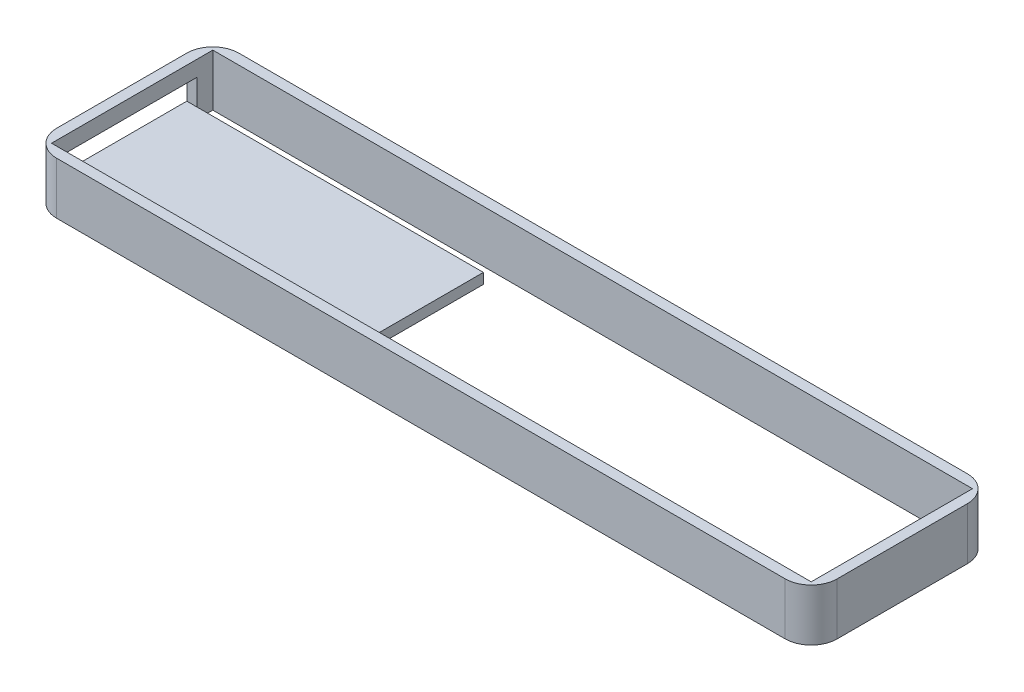
ISO-10303-21;
HEADER;
FILE_DESCRIPTION(('STEP AP214'),'2;1');
FILE_NAME('part.step','',(''),(''),'','','');
FILE_SCHEMA(('AUTOMOTIVE_DESIGN { 1 0 10303 214 1 1 1 1 }'));
ENDSEC;
DATA;
#1=APPLICATION_CONTEXT('core data for automotive mechanical design processes');
#2=APPLICATION_PROTOCOL_DEFINITION('international standard','automotive_design',2000,#1);
#3=PRODUCT_CONTEXT('',#1,'mechanical');
#4=PRODUCT('Part','Part','',(#3));
#5=PRODUCT_RELATED_PRODUCT_CATEGORY('part','',(#4));
#6=PRODUCT_DEFINITION_FORMATION('','',#4);
#7=PRODUCT_DEFINITION_CONTEXT('part definition',#1,'design');
#8=PRODUCT_DEFINITION('design','',#6,#7);
#9=PRODUCT_DEFINITION_SHAPE('','',#8);
#10=(LENGTH_UNIT() NAMED_UNIT(*) SI_UNIT(.MILLI.,.METRE.));
#11=(NAMED_UNIT(*) PLANE_ANGLE_UNIT() SI_UNIT($,.RADIAN.));
#12=(NAMED_UNIT(*) SI_UNIT($,.STERADIAN.) SOLID_ANGLE_UNIT());
#13=UNCERTAINTY_MEASURE_WITH_UNIT(LENGTH_MEASURE(1.E-05),#10,'distance_accuracy_value','');
#14=(GEOMETRIC_REPRESENTATION_CONTEXT(3) GLOBAL_UNCERTAINTY_ASSIGNED_CONTEXT((#13)) GLOBAL_UNIT_ASSIGNED_CONTEXT((#10,
#11,#12)) REPRESENTATION_CONTEXT('',''));
#15=CARTESIAN_POINT('',(0.,0.,0.));
#16=DIRECTION('',(0.,0.,1.));
#17=DIRECTION('',(1.,0.,0.));
#18=AXIS2_PLACEMENT_3D('',#15,#16,#17);
#19=CARTESIAN_POINT('',(-75.,10.,0.));
#20=DIRECTION('',(-1.,0.,0.));
#21=DIRECTION('',(0.,0.,1.));
#22=AXIS2_PLACEMENT_3D('',#19,#20,#21);
#23=PLANE('',#22);
#24=DIRECTION('',(0.,0.,-1.));
#25=VECTOR('',#24,1.);
#26=CARTESIAN_POINT('',(-75.,10.,0.));
#27=LINE('',#26,#25);
#28=CARTESIAN_POINT('',(-75.,10.,12.5));
#29=VERTEX_POINT('',#28);
#30=CARTESIAN_POINT('',(-75.,10.,-12.5));
#31=VERTEX_POINT('',#30);
#32=EDGE_CURVE('E248',#29,#31,#27,.T.);
#33=ORIENTED_EDGE('',*,*,#32,.T.);
#34=DIRECTION('',(0.,-1.,0.));
#35=VECTOR('',#34,1.);
#36=CARTESIAN_POINT('',(-75.,10.,-12.5));
#37=LINE('',#36,#35);
#38=CARTESIAN_POINT('',(-75.,7.,-12.5));
#39=VERTEX_POINT('',#38);
#40=EDGE_CURVE('E11',#31,#39,#37,.T.);
#41=ORIENTED_EDGE('',*,*,#40,.T.);
#42=DIRECTION('',(0.,0.,-1.));
#43=VECTOR('',#42,1.);
#44=CARTESIAN_POINT('',(-75.,7.,-12.5));
#45=LINE('',#44,#43);
#46=CARTESIAN_POINT('',(-75.,7.,12.5));
#47=VERTEX_POINT('',#46);
#48=EDGE_CURVE('E204',#47,#39,#45,.T.);
#49=ORIENTED_EDGE('',*,*,#48,.F.);
#50=DIRECTION('',(0.,-1.,0.));
#51=VECTOR('',#50,1.);
#52=CARTESIAN_POINT('',(-75.,10.,12.5));
#53=LINE('',#52,#51);
#54=EDGE_CURVE('E61',#47,#29,#53,.F.);
#55=ORIENTED_EDGE('',*,*,#54,.T.);
#56=EDGE_LOOP('',(#33,#41,#49,#55));
#57=FACE_BOUND('',#56,.T.);
#58=ADVANCED_FACE('F39',(#57),#23,.T.);
#59=CARTESIAN_POINT('',(0.,10.,12.5));
#60=DIRECTION('',(0.,0.,-1.));
#61=DIRECTION('',(-1.,0.,0.));
#62=AXIS2_PLACEMENT_3D('',#59,#60,#61);
#63=PLANE('',#62);
#64=DIRECTION('',(1.,0.,0.));
#65=VECTOR('',#64,1.);
#66=CARTESIAN_POINT('',(-73.,2.,12.5));
#67=LINE('',#66,#65);
#68=CARTESIAN_POINT('',(-73.,2.,12.5));
#69=VERTEX_POINT('',#68);
#70=CARTESIAN_POINT('',(-18.,2.,12.5));
#71=VERTEX_POINT('',#70);
#72=EDGE_CURVE('E222',#69,#71,#67,.T.);
#73=ORIENTED_EDGE('',*,*,#72,.F.);
#74=DIRECTION('',(0.,-1.,0.));
#75=VECTOR('',#74,1.);
#76=CARTESIAN_POINT('',(-73.,10.,12.5));
#77=LINE('',#76,#75);
#78=CARTESIAN_POINT('',(-73.,0.,12.5));
#79=VERTEX_POINT('',#78);
#80=EDGE_CURVE('E292',#69,#79,#77,.T.);
#81=ORIENTED_EDGE('',*,*,#80,.T.);
#82=DIRECTION('',(1.,0.,0.));
#83=VECTOR('',#82,1.);
#84=CARTESIAN_POINT('',(0.,0.,12.5));
#85=LINE('',#84,#83);
#86=CARTESIAN_POINT('',(-18.,0.,12.5));
#87=VERTEX_POINT('',#86);
#88=EDGE_CURVE('E259',#79,#87,#85,.T.);
#89=ORIENTED_EDGE('',*,*,#88,.T.);
#90=DIRECTION('',(0.,-1.,0.));
#91=VECTOR('',#90,1.);
#92=CARTESIAN_POINT('',(-18.,10.,12.5));
#93=LINE('',#92,#91);
#94=EDGE_CURVE('E290',#71,#87,#93,.T.);
#95=ORIENTED_EDGE('',*,*,#94,.F.);
#96=EDGE_LOOP('',(#73,#81,#89,#95));
#97=FACE_BOUND('',#96,.T.);
#98=ADVANCED_FACE('F369',(#97),#63,.F.);
#99=CARTESIAN_POINT('',(-18.,10.,0.));
#100=DIRECTION('',(1.,0.,0.));
#101=DIRECTION('',(0.,0.,-1.));
#102=AXIS2_PLACEMENT_3D('',#99,#100,#101);
#103=PLANE('',#102);
#104=DIRECTION('',(0.,-1.,0.));
#105=VECTOR('',#104,1.);
#106=CARTESIAN_POINT('',(-18.,10.,-12.5));
#107=LINE('',#106,#105);
#108=CARTESIAN_POINT('',(-18.,2.,-12.5));
#109=VERTEX_POINT('',#108);
#110=CARTESIAN_POINT('',(-18.,0.,-12.5));
#111=VERTEX_POINT('',#110);
#112=EDGE_CURVE('E288',#109,#111,#107,.T.);
#113=ORIENTED_EDGE('',*,*,#112,.F.);
#114=DIRECTION('',(0.,0.,-1.));
#115=VECTOR('',#114,1.);
#116=CARTESIAN_POINT('',(-18.,2.,-12.5));
#117=LINE('',#116,#115);
#118=EDGE_CURVE('E224',#71,#109,#117,.T.);
#119=ORIENTED_EDGE('',*,*,#118,.F.);
#120=ORIENTED_EDGE('',*,*,#94,.T.);
#121=DIRECTION('',(0.,0.,1.));
#122=VECTOR('',#121,1.);
#123=CARTESIAN_POINT('',(-18.,0.,0.));
#124=LINE('',#123,#122);
#125=EDGE_CURVE('E263',#111,#87,#124,.T.);
#126=ORIENTED_EDGE('',*,*,#125,.F.);
#127=EDGE_LOOP('',(#113,#119,#120,#126));
#128=FACE_BOUND('',#127,.T.);
#129=ADVANCED_FACE('F375',(#128),#103,.T.);
#130=CARTESIAN_POINT('',(0.,10.,-12.5));
#131=DIRECTION('',(0.,0.,-1.));
#132=DIRECTION('',(-1.,0.,0.));
#133=AXIS2_PLACEMENT_3D('',#130,#131,#132);
#134=PLANE('',#133);
#135=DIRECTION('',(0.,-1.,0.));
#136=VECTOR('',#135,1.);
#137=CARTESIAN_POINT('',(-73.,10.,-12.5));
#138=LINE('',#137,#136);
#139=CARTESIAN_POINT('',(-73.,2.,-12.5));
#140=VERTEX_POINT('',#139);
#141=CARTESIAN_POINT('',(-73.,0.,-12.5));
#142=VERTEX_POINT('',#141);
#143=EDGE_CURVE('E286',#140,#142,#138,.T.);
#144=ORIENTED_EDGE('',*,*,#143,.F.);
#145=DIRECTION('',(-1.,0.,0.));
#146=VECTOR('',#145,1.);
#147=CARTESIAN_POINT('',(-73.,2.,-12.5));
#148=LINE('',#147,#146);
#149=EDGE_CURVE('E226',#109,#140,#148,.T.);
#150=ORIENTED_EDGE('',*,*,#149,.F.);
#151=ORIENTED_EDGE('',*,*,#112,.T.);
#152=DIRECTION('',(1.,0.,0.));
#153=VECTOR('',#152,1.);
#154=CARTESIAN_POINT('',(0.,0.,-12.5));
#155=LINE('',#154,#153);
#156=EDGE_CURVE('E266',#142,#111,#155,.T.);
#157=ORIENTED_EDGE('',*,*,#156,.F.);
#158=EDGE_LOOP('',(#144,#150,#151,#157));
#159=FACE_BOUND('',#158,.T.);
#160=ADVANCED_FACE('F380',(#159),#134,.T.);
#161=CARTESIAN_POINT('',(0.,10.,17.5));
#162=DIRECTION('',(0.,0.,-1.));
#163=DIRECTION('',(-1.,0.,0.));
#164=AXIS2_PLACEMENT_3D('',#161,#162,#163);
#165=PLANE('',#164);
#166=DIRECTION('',(1.,0.,0.));
#167=VECTOR('',#166,1.);
#168=CARTESIAN_POINT('',(0.,0.,17.5));
#169=LINE('',#168,#167);
#170=CARTESIAN_POINT('',(-70.,0.,17.5));
#171=VERTEX_POINT('',#170);
#172=CARTESIAN_POINT('',(70.,0.,17.5));
#173=VERTEX_POINT('',#172);
#174=EDGE_CURVE('E272',#171,#173,#169,.T.);
#175=ORIENTED_EDGE('',*,*,#174,.T.);
#176=DIRECTION('',(0.,-1.,0.));
#177=VECTOR('',#176,1.);
#178=CARTESIAN_POINT('',(70.,10.,17.5));
#179=LINE('',#178,#177);
#180=CARTESIAN_POINT('',(70.,10.,17.5));
#181=VERTEX_POINT('',#180);
#182=EDGE_CURVE('E326',#173,#181,#179,.F.);
#183=ORIENTED_EDGE('',*,*,#182,.T.);
#184=DIRECTION('',(1.,0.,0.));
#185=VECTOR('',#184,1.);
#186=CARTESIAN_POINT('',(0.,10.,17.5));
#187=LINE('',#186,#185);
#188=CARTESIAN_POINT('',(-70.,10.,17.5));
#189=VERTEX_POINT('',#188);
#190=EDGE_CURVE('E239',#189,#181,#187,.T.);
#191=ORIENTED_EDGE('',*,*,#190,.F.);
#192=DIRECTION('',(0.,-1.,0.));
#193=VECTOR('',#192,1.);
#194=CARTESIAN_POINT('',(-70.,0.,17.5));
#195=LINE('',#194,#193);
#196=EDGE_CURVE('E323',#189,#171,#195,.T.);
#197=ORIENTED_EDGE('',*,*,#196,.T.);
#198=EDGE_LOOP('',(#175,#183,#191,#197));
#199=FACE_BOUND('',#198,.T.);
#200=ADVANCED_FACE('F355',(#199),#165,.F.);
#201=CARTESIAN_POINT('',(75.,10.,0.));
#202=DIRECTION('',(-1.,0.,0.));
#203=DIRECTION('',(0.,0.,1.));
#204=AXIS2_PLACEMENT_3D('',#201,#202,#203);
#205=PLANE('',#204);
#206=DIRECTION('',(0.,0.,-1.));
#207=VECTOR('',#206,1.);
#208=CARTESIAN_POINT('',(75.,0.,0.));
#209=LINE('',#208,#207);
#210=CARTESIAN_POINT('',(75.,0.,12.5));
#211=VERTEX_POINT('',#210);
#212=CARTESIAN_POINT('',(75.,0.,-12.5));
#213=VERTEX_POINT('',#212);
#214=EDGE_CURVE('E275',#211,#213,#209,.T.);
#215=ORIENTED_EDGE('',*,*,#214,.T.);
#216=DIRECTION('',(0.,-1.,0.));
#217=VECTOR('',#216,1.);
#218=CARTESIAN_POINT('',(75.,10.,-12.5));
#219=LINE('',#218,#217);
#220=CARTESIAN_POINT('',(75.,10.,-12.5));
#221=VERTEX_POINT('',#220);
#222=EDGE_CURVE('E314',#213,#221,#219,.F.);
#223=ORIENTED_EDGE('',*,*,#222,.T.);
#224=DIRECTION('',(0.,0.,-1.));
#225=VECTOR('',#224,1.);
#226=CARTESIAN_POINT('',(75.,10.,0.));
#227=LINE('',#226,#225);
#228=CARTESIAN_POINT('',(75.,10.,12.5));
#229=VERTEX_POINT('',#228);
#230=EDGE_CURVE('E242',#229,#221,#227,.T.);
#231=ORIENTED_EDGE('',*,*,#230,.F.);
#232=DIRECTION('',(0.,-1.,0.));
#233=VECTOR('',#232,1.);
#234=CARTESIAN_POINT('',(75.,10.,12.5));
#235=LINE('',#234,#233);
#236=EDGE_CURVE('E311',#229,#211,#235,.T.);
#237=ORIENTED_EDGE('',*,*,#236,.T.);
#238=EDGE_LOOP('',(#215,#223,#231,#237));
#239=FACE_BOUND('',#238,.T.);
#240=ADVANCED_FACE('F348',(#239),#205,.F.);
#241=CARTESIAN_POINT('',(0.,10.,-17.5));
#242=DIRECTION('',(0.,0.,-1.));
#243=DIRECTION('',(-1.,0.,0.));
#244=AXIS2_PLACEMENT_3D('',#241,#242,#243);
#245=PLANE('',#244);
#246=DIRECTION('',(1.,0.,0.));
#247=VECTOR('',#246,1.);
#248=CARTESIAN_POINT('',(0.,10.,-17.5));
#249=LINE('',#248,#247);
#250=CARTESIAN_POINT('',(-70.,10.,-17.5));
#251=VERTEX_POINT('',#250);
#252=CARTESIAN_POINT('',(70.,10.,-17.5));
#253=VERTEX_POINT('',#252);
#254=EDGE_CURVE('E245',#251,#253,#249,.T.);
#255=ORIENTED_EDGE('',*,*,#254,.T.);
#256=DIRECTION('',(0.,-1.,0.));
#257=VECTOR('',#256,1.);
#258=CARTESIAN_POINT('',(70.,0.,-17.5));
#259=LINE('',#258,#257);
#260=CARTESIAN_POINT('',(70.,0.,-17.5));
#261=VERTEX_POINT('',#260);
#262=EDGE_CURVE('E300',#253,#261,#259,.T.);
#263=ORIENTED_EDGE('',*,*,#262,.T.);
#264=DIRECTION('',(1.,0.,0.));
#265=VECTOR('',#264,1.);
#266=CARTESIAN_POINT('',(0.,0.,-17.5));
#267=LINE('',#266,#265);
#268=CARTESIAN_POINT('',(-70.,0.,-17.5));
#269=VERTEX_POINT('',#268);
#270=EDGE_CURVE('E278',#269,#261,#267,.T.);
#271=ORIENTED_EDGE('',*,*,#270,.F.);
#272=DIRECTION('',(0.,-1.,0.));
#273=VECTOR('',#272,1.);
#274=CARTESIAN_POINT('',(-70.,10.,-17.5));
#275=LINE('',#274,#273);
#276=EDGE_CURVE('E298',#269,#251,#275,.F.);
#277=ORIENTED_EDGE('',*,*,#276,.T.);
#278=EDGE_LOOP('',(#255,#263,#271,#277));
#279=FACE_BOUND('',#278,.T.);
#280=ADVANCED_FACE('F338',(#279),#245,.T.);
#281=CARTESIAN_POINT('',(73.,10.,0.));
#282=DIRECTION('',(-1.,0.,0.));
#283=DIRECTION('',(0.,0.,1.));
#284=AXIS2_PLACEMENT_3D('',#281,#282,#283);
#285=PLANE('',#284);
#286=DIRECTION('',(0.,0.,-1.));
#287=VECTOR('',#286,1.);
#288=CARTESIAN_POINT('',(73.,0.,0.));
#289=LINE('',#288,#287);
#290=CARTESIAN_POINT('',(73.,0.,15.5));
#291=VERTEX_POINT('',#290);
#292=CARTESIAN_POINT('',(73.,0.,-15.5));
#293=VERTEX_POINT('',#292);
#294=EDGE_CURVE('E228',#291,#293,#289,.T.);
#295=ORIENTED_EDGE('',*,*,#294,.F.);
#296=DIRECTION('',(0.,-1.,0.));
#297=VECTOR('',#296,1.);
#298=CARTESIAN_POINT('',(73.,10.,15.5));
#299=LINE('',#298,#297);
#300=CARTESIAN_POINT('',(73.,10.,15.5));
#301=VERTEX_POINT('',#300);
#302=EDGE_CURVE('E296',#301,#291,#299,.T.);
#303=ORIENTED_EDGE('',*,*,#302,.F.);
#304=DIRECTION('',(0.,0.,-1.));
#305=VECTOR('',#304,1.);
#306=CARTESIAN_POINT('',(73.,10.,0.));
#307=LINE('',#306,#305);
#308=CARTESIAN_POINT('',(73.,10.,-15.5));
#309=VERTEX_POINT('',#308);
#310=EDGE_CURVE('E229',#301,#309,#307,.T.);
#311=ORIENTED_EDGE('',*,*,#310,.T.);
#312=DIRECTION('',(0.,-1.,0.));
#313=VECTOR('',#312,1.);
#314=CARTESIAN_POINT('',(73.,10.,-15.5));
#315=LINE('',#314,#313);
#316=EDGE_CURVE('E250',#309,#293,#315,.T.);
#317=ORIENTED_EDGE('',*,*,#316,.T.);
#318=EDGE_LOOP('',(#295,#303,#311,#317));
#319=FACE_BOUND('',#318,.T.);
#320=ADVANCED_FACE('F398',(#319),#285,.T.);
#321=CARTESIAN_POINT('',(0.,10.,15.5));
#322=DIRECTION('',(0.,0.,-1.));
#323=DIRECTION('',(-1.,0.,0.));
#324=AXIS2_PLACEMENT_3D('',#321,#322,#323);
#325=PLANE('',#324);
#326=DIRECTION('',(1.,0.,0.));
#327=VECTOR('',#326,1.);
#328=CARTESIAN_POINT('',(0.,0.,15.5));
#329=LINE('',#328,#327);
#330=CARTESIAN_POINT('',(-73.,0.,15.5));
#331=VERTEX_POINT('',#330);
#332=EDGE_CURVE('E253',#331,#291,#329,.T.);
#333=ORIENTED_EDGE('',*,*,#332,.F.);
#334=DIRECTION('',(0.,-1.,0.));
#335=VECTOR('',#334,1.);
#336=CARTESIAN_POINT('',(-73.,10.,15.5));
#337=LINE('',#336,#335);
#338=CARTESIAN_POINT('',(-73.,10.,15.5));
#339=VERTEX_POINT('',#338);
#340=EDGE_CURVE('E294',#339,#331,#337,.T.);
#341=ORIENTED_EDGE('',*,*,#340,.F.);
#342=DIRECTION('',(1.,0.,0.));
#343=VECTOR('',#342,1.);
#344=CARTESIAN_POINT('',(0.,10.,15.5));
#345=LINE('',#344,#343);
#346=EDGE_CURVE('E232',#339,#301,#345,.T.);
#347=ORIENTED_EDGE('',*,*,#346,.T.);
#348=ORIENTED_EDGE('',*,*,#302,.T.);
#349=EDGE_LOOP('',(#333,#341,#347,#348));
#350=FACE_BOUND('',#349,.T.);
#351=ADVANCED_FACE('F396',(#350),#325,.T.);
#352=CARTESIAN_POINT('',(-73.,10.,0.));
#353=DIRECTION('',(-1.,0.,0.));
#354=DIRECTION('',(0.,0.,1.));
#355=AXIS2_PLACEMENT_3D('',#352,#353,#354);
#356=PLANE('',#355);
#357=DIRECTION('',(0.,0.,-1.));
#358=VECTOR('',#357,1.);
#359=CARTESIAN_POINT('',(-73.,7.,0.));
#360=LINE('',#359,#358);
#361=CARTESIAN_POINT('',(-73.,7.,12.5));
#362=VERTEX_POINT('',#361);
#363=CARTESIAN_POINT('',(-73.,7.,-12.5));
#364=VERTEX_POINT('',#363);
#365=EDGE_CURVE('E219',#362,#364,#360,.T.);
#366=ORIENTED_EDGE('',*,*,#365,.T.);
#367=DIRECTION('',(0.,-1.,0.));
#368=VECTOR('',#367,1.);
#369=CARTESIAN_POINT('',(-73.,10.,-12.5));
#370=LINE('',#369,#368);
#371=EDGE_CURVE('E216',#364,#140,#370,.T.);
#372=ORIENTED_EDGE('',*,*,#371,.T.);
#373=ORIENTED_EDGE('',*,*,#143,.T.);
#374=DIRECTION('',(0.,0.,-1.));
#375=VECTOR('',#374,1.);
#376=CARTESIAN_POINT('',(-73.,0.,0.));
#377=LINE('',#376,#375);
#378=CARTESIAN_POINT('',(-73.,0.,-15.5));
#379=VERTEX_POINT('',#378);
#380=EDGE_CURVE('E260',#142,#379,#377,.T.);
#381=ORIENTED_EDGE('',*,*,#380,.T.);
#382=DIRECTION('',(0.,-1.,0.));
#383=VECTOR('',#382,1.);
#384=CARTESIAN_POINT('',(-73.,10.,-15.5));
#385=LINE('',#384,#383);
#386=CARTESIAN_POINT('',(-73.,10.,-15.5));
#387=VERTEX_POINT('',#386);
#388=EDGE_CURVE('E283',#387,#379,#385,.T.);
#389=ORIENTED_EDGE('',*,*,#388,.F.);
#390=DIRECTION('',(0.,0.,-1.));
#391=VECTOR('',#390,1.);
#392=CARTESIAN_POINT('',(-73.,10.,0.));
#393=LINE('',#392,#391);
#394=EDGE_CURVE('E235',#339,#387,#393,.T.);
#395=ORIENTED_EDGE('',*,*,#394,.F.);
#396=ORIENTED_EDGE('',*,*,#340,.T.);
#397=EDGE_CURVE('E256',#331,#79,#377,.T.);
#398=ORIENTED_EDGE('',*,*,#397,.T.);
#399=ORIENTED_EDGE('',*,*,#80,.F.);
#400=DIRECTION('',(0.,1.,0.));
#401=VECTOR('',#400,1.);
#402=CARTESIAN_POINT('',(-73.,10.,12.5));
#403=LINE('',#402,#401);
#404=EDGE_CURVE('E192',#69,#362,#403,.T.);
#405=ORIENTED_EDGE('',*,*,#404,.T.);
#406=EDGE_LOOP('',(#366,#372,#373,#381,#389,#395,#396,#398,#399,#405));
#407=FACE_BOUND('',#406,.T.);
#408=ADVANCED_FACE('F365',(#407),#356,.F.);
#409=CARTESIAN_POINT('',(0.,10.,-15.5));
#410=DIRECTION('',(0.,0.,-1.));
#411=DIRECTION('',(-1.,0.,0.));
#412=AXIS2_PLACEMENT_3D('',#409,#410,#411);
#413=PLANE('',#412);
#414=DIRECTION('',(1.,0.,0.));
#415=VECTOR('',#414,1.);
#416=CARTESIAN_POINT('',(0.,0.,-15.5));
#417=LINE('',#416,#415);
#418=EDGE_CURVE('E269',#379,#293,#417,.T.);
#419=ORIENTED_EDGE('',*,*,#418,.T.);
#420=ORIENTED_EDGE('',*,*,#316,.F.);
#421=DIRECTION('',(1.,0.,0.));
#422=VECTOR('',#421,1.);
#423=CARTESIAN_POINT('',(0.,10.,-15.5));
#424=LINE('',#423,#422);
#425=EDGE_CURVE('E237',#387,#309,#424,.T.);
#426=ORIENTED_EDGE('',*,*,#425,.F.);
#427=ORIENTED_EDGE('',*,*,#388,.T.);
#428=EDGE_LOOP('',(#419,#420,#426,#427));
#429=FACE_BOUND('',#428,.T.);
#430=ADVANCED_FACE('F388',(#429),#413,.F.);
#431=DIRECTION('',(0.,0.,1.));
#432=VECTOR('',#431,1.);
#433=CARTESIAN_POINT('',(-75.,2.,-12.5));
#434=LINE('',#433,#432);
#435=CARTESIAN_POINT('',(-75.,2.,-12.5));
#436=VERTEX_POINT('',#435);
#437=CARTESIAN_POINT('',(-75.,2.,12.5));
#438=VERTEX_POINT('',#437);
#439=EDGE_CURVE('E177',#436,#438,#434,.T.);
#440=ORIENTED_EDGE('',*,*,#439,.F.);
#441=DIRECTION('',(0.,-1.,0.));
#442=VECTOR('',#441,1.);
#443=CARTESIAN_POINT('',(-75.,10.,-12.5));
#444=LINE('',#443,#442);
#445=CARTESIAN_POINT('',(-75.,0.,-12.5));
#446=VERTEX_POINT('',#445);
#447=EDGE_CURVE('E47',#436,#446,#444,.T.);
#448=ORIENTED_EDGE('',*,*,#447,.T.);
#449=DIRECTION('',(0.,0.,-1.));
#450=VECTOR('',#449,1.);
#451=CARTESIAN_POINT('',(-75.,0.,0.));
#452=LINE('',#451,#450);
#453=CARTESIAN_POINT('',(-75.,0.,12.5));
#454=VERTEX_POINT('',#453);
#455=EDGE_CURVE('E180',#454,#446,#452,.T.);
#456=ORIENTED_EDGE('',*,*,#455,.F.);
#457=DIRECTION('',(0.,-1.,0.));
#458=VECTOR('',#457,1.);
#459=CARTESIAN_POINT('',(-75.,10.,12.5));
#460=LINE('',#459,#458);
#461=EDGE_CURVE('E173',#454,#438,#460,.F.);
#462=ORIENTED_EDGE('',*,*,#461,.T.);
#463=EDGE_LOOP('',(#440,#448,#456,#462));
#464=FACE_BOUND('',#463,.T.);
#465=ADVANCED_FACE('F175',(#464),#23,.T.);
#466=CARTESIAN_POINT('',(0.,10.,0.));
#467=DIRECTION('',(0.,1.,0.));
#468=DIRECTION('',(0.,0.,1.));
#469=AXIS2_PLACEMENT_3D('',#466,#467,#468);
#470=PLANE('',#469);
#471=ORIENTED_EDGE('',*,*,#394,.T.);
#472=ORIENTED_EDGE('',*,*,#425,.T.);
#473=ORIENTED_EDGE('',*,*,#310,.F.);
#474=ORIENTED_EDGE('',*,*,#346,.F.);
#475=EDGE_LOOP('',(#471,#472,#473,#474));
#476=FACE_BOUND('',#475,.T.);
#477=ORIENTED_EDGE('',*,*,#230,.T.);
#478=CARTESIAN_POINT('',(70.,10.,-12.5));
#479=DIRECTION('',(0.,1.,0.));
#480=DIRECTION('',(0.,0.,1.));
#481=AXIS2_PLACEMENT_3D('',#478,#479,#480);
#482=CIRCLE('',#481,5.);
#483=EDGE_CURVE('E321',#221,#253,#482,.T.);
#484=ORIENTED_EDGE('',*,*,#483,.T.);
#485=ORIENTED_EDGE('',*,*,#254,.F.);
#486=CARTESIAN_POINT('',(-70.,10.,-12.5));
#487=DIRECTION('',(0.,1.,0.));
#488=DIRECTION('',(0.,0.,1.));
#489=AXIS2_PLACEMENT_3D('',#486,#487,#488);
#490=CIRCLE('',#489,5.);
#491=EDGE_CURVE('E54',#251,#31,#490,.T.);
#492=ORIENTED_EDGE('',*,*,#491,.T.);
#493=ORIENTED_EDGE('',*,*,#32,.F.);
#494=CARTESIAN_POINT('',(-70.,10.,12.5));
#495=DIRECTION('',(0.,1.,0.));
#496=DIRECTION('',(0.,0.,1.));
#497=AXIS2_PLACEMENT_3D('',#494,#495,#496);
#498=CIRCLE('',#497,5.);
#499=EDGE_CURVE('E316',#29,#189,#498,.T.);
#500=ORIENTED_EDGE('',*,*,#499,.T.);
#501=ORIENTED_EDGE('',*,*,#190,.T.);
#502=CARTESIAN_POINT('',(70.,10.,12.5));
#503=DIRECTION('',(0.,1.,0.));
#504=DIRECTION('',(0.,0.,1.));
#505=AXIS2_PLACEMENT_3D('',#502,#503,#504);
#506=CIRCLE('',#505,5.);
#507=EDGE_CURVE('E319',#181,#229,#506,.T.);
#508=ORIENTED_EDGE('',*,*,#507,.T.);
#509=EDGE_LOOP('',(#477,#484,#485,#492,#493,#500,#501,#508));
#510=FACE_BOUND('',#509,.T.);
#511=ADVANCED_FACE('F340',(#476,#510),#470,.T.);
#512=CARTESIAN_POINT('',(0.,0.,0.));
#513=DIRECTION('',(0.,1.,0.));
#514=DIRECTION('',(0.,0.,1.));
#515=AXIS2_PLACEMENT_3D('',#512,#513,#514);
#516=PLANE('',#515);
#517=ORIENTED_EDGE('',*,*,#294,.T.);
#518=ORIENTED_EDGE('',*,*,#418,.F.);
#519=ORIENTED_EDGE('',*,*,#380,.F.);
#520=ORIENTED_EDGE('',*,*,#156,.T.);
#521=ORIENTED_EDGE('',*,*,#125,.T.);
#522=ORIENTED_EDGE('',*,*,#88,.F.);
#523=ORIENTED_EDGE('',*,*,#397,.F.);
#524=ORIENTED_EDGE('',*,*,#332,.T.);
#525=EDGE_LOOP('',(#517,#518,#519,#520,#521,#522,#523,#524));
#526=FACE_BOUND('',#525,.T.);
#527=ORIENTED_EDGE('',*,*,#270,.T.);
#528=CARTESIAN_POINT('',(70.,0.,-12.5));
#529=DIRECTION('',(0.,1.,0.));
#530=DIRECTION('',(0.,0.,1.));
#531=AXIS2_PLACEMENT_3D('',#528,#529,#530);
#532=CIRCLE('',#531,5.);
#533=EDGE_CURVE('E309',#261,#213,#532,.F.);
#534=ORIENTED_EDGE('',*,*,#533,.T.);
#535=ORIENTED_EDGE('',*,*,#214,.F.);
#536=CARTESIAN_POINT('',(70.,0.,12.5));
#537=DIRECTION('',(0.,1.,0.));
#538=DIRECTION('',(0.,0.,1.));
#539=AXIS2_PLACEMENT_3D('',#536,#537,#538);
#540=CIRCLE('',#539,5.);
#541=EDGE_CURVE('E307',#211,#173,#540,.F.);
#542=ORIENTED_EDGE('',*,*,#541,.T.);
#543=ORIENTED_EDGE('',*,*,#174,.F.);
#544=CARTESIAN_POINT('',(-70.,0.,12.5));
#545=DIRECTION('',(0.,1.,0.));
#546=DIRECTION('',(0.,0.,1.));
#547=AXIS2_PLACEMENT_3D('',#544,#545,#546);
#548=CIRCLE('',#547,5.);
#549=EDGE_CURVE('E303',#171,#454,#548,.F.);
#550=ORIENTED_EDGE('',*,*,#549,.T.);
#551=ORIENTED_EDGE('',*,*,#455,.T.);
#552=CARTESIAN_POINT('',(-70.,0.,-12.5));
#553=DIRECTION('',(0.,1.,0.));
#554=DIRECTION('',(0.,0.,1.));
#555=AXIS2_PLACEMENT_3D('',#552,#553,#554);
#556=CIRCLE('',#555,5.);
#557=EDGE_CURVE('E305',#446,#269,#556,.F.);
#558=ORIENTED_EDGE('',*,*,#557,.T.);
#559=EDGE_LOOP('',(#527,#534,#535,#542,#543,#550,#551,#558));
#560=FACE_BOUND('',#559,.T.);
#561=ADVANCED_FACE('F331',(#526,#560),#516,.F.);
#562=CARTESIAN_POINT('',(0.,2.,0.));
#563=DIRECTION('',(0.,1.,0.));
#564=DIRECTION('',(0.,0.,1.));
#565=AXIS2_PLACEMENT_3D('',#562,#563,#564);
#566=PLANE('',#565);
#567=ORIENTED_EDGE('',*,*,#72,.T.);
#568=ORIENTED_EDGE('',*,*,#118,.T.);
#569=ORIENTED_EDGE('',*,*,#149,.T.);
#570=DIRECTION('',(-1.,0.,0.));
#571=VECTOR('',#570,1.);
#572=CARTESIAN_POINT('',(-67.,2.,-12.5));
#573=LINE('',#572,#571);
#574=EDGE_CURVE('E196',#140,#436,#573,.T.);
#575=ORIENTED_EDGE('',*,*,#574,.T.);
#576=ORIENTED_EDGE('',*,*,#439,.T.);
#577=DIRECTION('',(-1.,0.,0.));
#578=VECTOR('',#577,1.);
#579=CARTESIAN_POINT('',(-67.,2.,12.5));
#580=LINE('',#579,#578);
#581=EDGE_CURVE('E187',#69,#438,#580,.T.);
#582=ORIENTED_EDGE('',*,*,#581,.F.);
#583=EDGE_LOOP('',(#567,#568,#569,#575,#576,#582));
#584=FACE_BOUND('',#583,.T.);
#585=ADVANCED_FACE('F199',(#584),#566,.T.);
#586=CARTESIAN_POINT('',(-67.,7.,-12.5));
#587=DIRECTION('',(0.,1.,0.));
#588=DIRECTION('',(0.,0.,1.));
#589=AXIS2_PLACEMENT_3D('',#586,#587,#588);
#590=PLANE('',#589);
#591=DIRECTION('',(-1.,0.,0.));
#592=VECTOR('',#591,1.);
#593=CARTESIAN_POINT('',(-67.,7.,12.5));
#594=LINE('',#593,#592);
#595=EDGE_CURVE('E195',#362,#47,#594,.T.);
#596=ORIENTED_EDGE('',*,*,#595,.T.);
#597=ORIENTED_EDGE('',*,*,#48,.T.);
#598=DIRECTION('',(-1.,0.,0.));
#599=VECTOR('',#598,1.);
#600=CARTESIAN_POINT('',(-67.,7.,-12.5));
#601=LINE('',#600,#599);
#602=EDGE_CURVE('E210',#364,#39,#601,.T.);
#603=ORIENTED_EDGE('',*,*,#602,.F.);
#604=ORIENTED_EDGE('',*,*,#365,.F.);
#605=EDGE_LOOP('',(#596,#597,#603,#604));
#606=FACE_BOUND('',#605,.T.);
#607=ADVANCED_FACE('F362',(#606),#590,.F.);
#608=CARTESIAN_POINT('',(-67.,7.,-12.5));
#609=DIRECTION('',(0.,0.,-1.));
#610=DIRECTION('',(-1.,0.,0.));
#611=AXIS2_PLACEMENT_3D('',#608,#609,#610);
#612=PLANE('',#611);
#613=ORIENTED_EDGE('',*,*,#602,.T.);
#614=DIRECTION('',(0.,-1.,0.));
#615=VECTOR('',#614,1.);
#616=CARTESIAN_POINT('',(-75.,7.,-12.5));
#617=LINE('',#616,#615);
#618=EDGE_CURVE('E201',#39,#436,#617,.T.);
#619=ORIENTED_EDGE('',*,*,#618,.T.);
#620=ORIENTED_EDGE('',*,*,#574,.F.);
#621=ORIENTED_EDGE('',*,*,#371,.F.);
#622=EDGE_LOOP('',(#613,#619,#620,#621));
#623=FACE_BOUND('',#622,.T.);
#624=ADVANCED_FACE('F359',(#623),#612,.F.);
#625=CARTESIAN_POINT('',(-67.,7.,12.5));
#626=DIRECTION('',(0.,0.,1.));
#627=DIRECTION('',(1.,0.,0.));
#628=AXIS2_PLACEMENT_3D('',#625,#626,#627);
#629=PLANE('',#628);
#630=ORIENTED_EDGE('',*,*,#581,.T.);
#631=DIRECTION('',(0.,1.,0.));
#632=VECTOR('',#631,1.);
#633=CARTESIAN_POINT('',(-75.,7.,12.5));
#634=LINE('',#633,#632);
#635=EDGE_CURVE('E190',#438,#47,#634,.T.);
#636=ORIENTED_EDGE('',*,*,#635,.T.);
#637=ORIENTED_EDGE('',*,*,#595,.F.);
#638=ORIENTED_EDGE('',*,*,#404,.F.);
#639=EDGE_LOOP('',(#630,#636,#637,#638));
#640=FACE_BOUND('',#639,.T.);
#641=ADVANCED_FACE('F188',(#640),#629,.F.);
#642=CARTESIAN_POINT('',(70.,10.,-12.5));
#643=DIRECTION('',(0.,1.,0.));
#644=DIRECTION('',(0.,0.,1.));
#645=AXIS2_PLACEMENT_3D('',#642,#643,#644);
#646=CYLINDRICAL_SURFACE('',#645,5.);
#647=ORIENTED_EDGE('',*,*,#483,.F.);
#648=ORIENTED_EDGE('',*,*,#222,.F.);
#649=ORIENTED_EDGE('',*,*,#533,.F.);
#650=ORIENTED_EDGE('',*,*,#262,.F.);
#651=EDGE_LOOP('',(#647,#648,#649,#650));
#652=FACE_BOUND('',#651,.T.);
#653=ADVANCED_FACE('F345',(#652),#646,.T.);
#654=CARTESIAN_POINT('',(70.,10.,12.5));
#655=DIRECTION('',(0.,-1.,0.));
#656=DIRECTION('',(0.,0.,-1.));
#657=AXIS2_PLACEMENT_3D('',#654,#655,#656);
#658=CYLINDRICAL_SURFACE('',#657,5.);
#659=ORIENTED_EDGE('',*,*,#507,.F.);
#660=ORIENTED_EDGE('',*,*,#182,.F.);
#661=ORIENTED_EDGE('',*,*,#541,.F.);
#662=ORIENTED_EDGE('',*,*,#236,.F.);
#663=EDGE_LOOP('',(#659,#660,#661,#662));
#664=FACE_BOUND('',#663,.T.);
#665=ADVANCED_FACE('F352',(#664),#658,.T.);
#666=CARTESIAN_POINT('',(-70.,10.,-12.5));
#667=DIRECTION('',(0.,-1.,0.));
#668=DIRECTION('',(0.,0.,-1.));
#669=AXIS2_PLACEMENT_3D('',#666,#667,#668);
#670=CYLINDRICAL_SURFACE('',#669,5.);
#671=ORIENTED_EDGE('',*,*,#491,.F.);
#672=ORIENTED_EDGE('',*,*,#276,.F.);
#673=ORIENTED_EDGE('',*,*,#557,.F.);
#674=ORIENTED_EDGE('',*,*,#447,.F.);
#675=ORIENTED_EDGE('',*,*,#618,.F.);
#676=ORIENTED_EDGE('',*,*,#40,.F.);
#677=EDGE_LOOP('',(#671,#672,#673,#674,#675,#676));
#678=FACE_BOUND('',#677,.T.);
#679=ADVANCED_FACE('F335',(#678),#670,.T.);
#680=CARTESIAN_POINT('',(-70.,10.,12.5));
#681=DIRECTION('',(0.,1.,0.));
#682=DIRECTION('',(0.,0.,1.));
#683=AXIS2_PLACEMENT_3D('',#680,#681,#682);
#684=CYLINDRICAL_SURFACE('',#683,5.);
#685=ORIENTED_EDGE('',*,*,#635,.F.);
#686=ORIENTED_EDGE('',*,*,#461,.F.);
#687=ORIENTED_EDGE('',*,*,#549,.F.);
#688=ORIENTED_EDGE('',*,*,#196,.F.);
#689=ORIENTED_EDGE('',*,*,#499,.F.);
#690=ORIENTED_EDGE('',*,*,#54,.F.);
#691=EDGE_LOOP('',(#685,#686,#687,#688,#689,#690));
#692=FACE_BOUND('',#691,.T.);
#693=ADVANCED_FACE('F41',(#692),#684,.T.);
#694=CLOSED_SHELL('',(#58,#98,#129,#160,#200,#240,#280,#320,#351,#408,#430,#465,#511,#561,#585,
#607,#624,#641,#653,#665,#679,#693));
#695=MANIFOLD_SOLID_BREP('B2',#694);
#696=ADVANCED_BREP_SHAPE_REPRESENTATION('',(#18,#695),#14);
#697=SHAPE_DEFINITION_REPRESENTATION(#9,#696);
ENDSEC;
END-ISO-10303-21;
